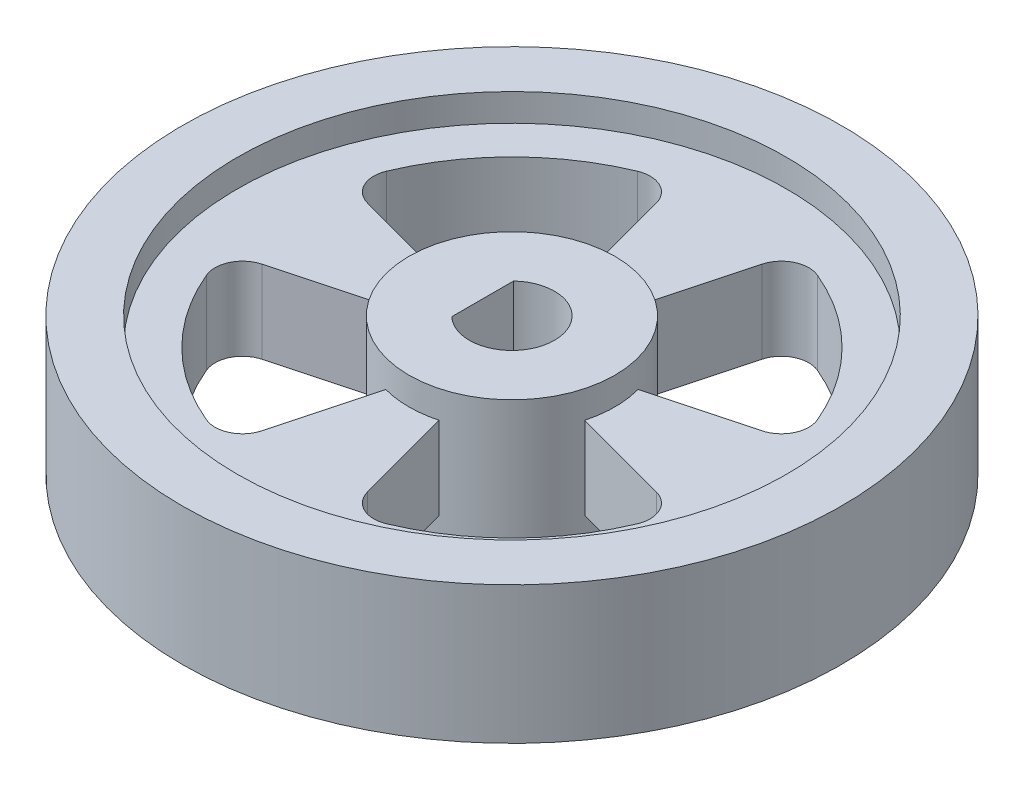
ISO-10303-21;
HEADER;
FILE_DESCRIPTION(('STEP AP214'),'2;1');
FILE_NAME('part.step','',(''),(''),'','','');
FILE_SCHEMA(('AUTOMOTIVE_DESIGN { 1 0 10303 214 1 1 1 1 }'));
ENDSEC;
DATA;
#1=APPLICATION_CONTEXT('core data for automotive mechanical design processes');
#2=APPLICATION_PROTOCOL_DEFINITION('international standard','automotive_design',2000,#1);
#3=PRODUCT_CONTEXT('',#1,'mechanical');
#4=PRODUCT('Part','Part','',(#3));
#5=PRODUCT_RELATED_PRODUCT_CATEGORY('part','',(#4));
#6=PRODUCT_DEFINITION_FORMATION('','',#4);
#7=PRODUCT_DEFINITION_CONTEXT('part definition',#1,'design');
#8=PRODUCT_DEFINITION('design','',#6,#7);
#9=PRODUCT_DEFINITION_SHAPE('','',#8);
#10=(LENGTH_UNIT() NAMED_UNIT(*) SI_UNIT(.MILLI.,.METRE.));
#11=(NAMED_UNIT(*) PLANE_ANGLE_UNIT() SI_UNIT($,.RADIAN.));
#12=(NAMED_UNIT(*) SI_UNIT($,.STERADIAN.) SOLID_ANGLE_UNIT());
#13=UNCERTAINTY_MEASURE_WITH_UNIT(LENGTH_MEASURE(1.E-05),#10,'distance_accuracy_value','');
#14=(GEOMETRIC_REPRESENTATION_CONTEXT(3) GLOBAL_UNCERTAINTY_ASSIGNED_CONTEXT((#13)) GLOBAL_UNIT_ASSIGNED_CONTEXT((#10,
#11,#12)) REPRESENTATION_CONTEXT('',''));
#15=CARTESIAN_POINT('',(0.,0.,0.));
#16=DIRECTION('',(0.,0.,1.));
#17=DIRECTION('',(1.,0.,0.));
#18=AXIS2_PLACEMENT_3D('',#15,#16,#17);
#19=CARTESIAN_POINT('',(0.,3.,0.));
#20=DIRECTION('',(0.,1.,0.));
#21=DIRECTION('',(0.,0.,1.));
#22=AXIS2_PLACEMENT_3D('',#19,#20,#21);
#23=PLANE('',#22);
#24=CARTESIAN_POINT('',(0.,3.,0.));
#25=DIRECTION('',(0.,1.,0.));
#26=DIRECTION('',(0.,0.,1.));
#27=AXIS2_PLACEMENT_3D('',#24,#25,#26);
#28=CIRCLE('',#27,20.);
#29=CARTESIAN_POINT('',(0.,3.,20.));
#30=VERTEX_POINT('',#29);
#31=EDGE_CURVE('E406',#30,#30,#28,.T.);
#32=ORIENTED_EDGE('',*,*,#31,.T.);
#33=EDGE_LOOP('',(#32));
#34=FACE_BOUND('',#33,.T.);
#35=CARTESIAN_POINT('',(0.,3.,0.));
#36=DIRECTION('',(0.,1.,0.));
#37=DIRECTION('',(0.,0.,1.));
#38=AXIS2_PLACEMENT_3D('',#35,#36,#37);
#39=CIRCLE('',#38,7.5);
#40=CARTESIAN_POINT('',(1.94114283826891,3.,7.24444369716801));
#41=VERTEX_POINT('',#40);
#42=CARTESIAN_POINT('',(-1.94114283826891,3.,7.24444369716801));
#43=VERTEX_POINT('',#42);
#44=EDGE_CURVE('E51',#41,#43,#39,.F.);
#45=ORIENTED_EDGE('',*,*,#44,.T.);
#46=DIRECTION('',(-0.258819045102522,0.,0.965925826289068));
#47=VECTOR('',#46,1.);
#48=CARTESIAN_POINT('',(0.,3.,0.));
#49=LINE('',#48,#47);
#50=CARTESIAN_POINT('',(-3.84762171760941,3.,14.3595197384237));
#51=VERTEX_POINT('',#50);
#52=EDGE_CURVE('E299',#43,#51,#49,.T.);
#53=ORIENTED_EDGE('',*,*,#52,.T.);
#54=CARTESIAN_POINT('',(-5.77947337018755,3.,13.8418816482187));
#55=DIRECTION('',(0.,1.,0.));
#56=DIRECTION('',(0.,0.,1.));
#57=AXIS2_PLACEMENT_3D('',#54,#55,#56);
#58=CIRCLE('',#57,2.);
#59=CARTESIAN_POINT('',(-6.55006981954588,3.,15.6874658679812));
#60=VERTEX_POINT('',#59);
#61=EDGE_CURVE('E296',#60,#51,#58,.T.);
#62=ORIENTED_EDGE('',*,*,#61,.F.);
#63=CARTESIAN_POINT('',(0.,3.,0.));
#64=DIRECTION('',(0.,1.,0.));
#65=DIRECTION('',(0.,0.,1.));
#66=AXIS2_PLACEMENT_3D('',#63,#64,#65);
#67=CIRCLE('',#66,17.);
#68=CARTESIAN_POINT('',(-15.6874658679812,3.,6.55006981954589));
#69=VERTEX_POINT('',#68);
#70=EDGE_CURVE('E293',#60,#69,#67,.F.);
#71=ORIENTED_EDGE('',*,*,#70,.T.);
#72=CARTESIAN_POINT('',(-13.8418816482187,3.,5.77947337018755));
#73=DIRECTION('',(0.,1.,0.));
#74=DIRECTION('',(0.,0.,1.));
#75=AXIS2_PLACEMENT_3D('',#72,#73,#74);
#76=CIRCLE('',#75,2.);
#77=CARTESIAN_POINT('',(-14.3595197384237,3.,3.84762171760942));
#78=VERTEX_POINT('',#77);
#79=EDGE_CURVE('E281',#78,#69,#76,.T.);
#80=ORIENTED_EDGE('',*,*,#79,.F.);
#81=DIRECTION('',(-0.965925826289068,0.,0.258819045102522));
#82=VECTOR('',#81,1.);
#83=CARTESIAN_POINT('',(0.,3.,0.));
#84=LINE('',#83,#82);
#85=CARTESIAN_POINT('',(-7.24444369716801,3.,1.94114283826891));
#86=VERTEX_POINT('',#85);
#87=EDGE_CURVE('E302',#86,#78,#84,.T.);
#88=ORIENTED_EDGE('',*,*,#87,.F.);
#89=CARTESIAN_POINT('',(-7.24444369716801,3.,-1.94114283826891));
#90=VERTEX_POINT('',#89);
#91=EDGE_CURVE('E12',#86,#90,#39,.F.);
#92=ORIENTED_EDGE('',*,*,#91,.T.);
#93=DIRECTION('',(-0.965925826289068,0.,-0.258819045102521));
#94=VECTOR('',#93,1.);
#95=CARTESIAN_POINT('',(0.,3.,0.));
#96=LINE('',#95,#94);
#97=CARTESIAN_POINT('',(-14.3595197384237,3.,-3.84762171760941));
#98=VERTEX_POINT('',#97);
#99=EDGE_CURVE('E375',#90,#98,#96,.T.);
#100=ORIENTED_EDGE('',*,*,#99,.T.);
#101=CARTESIAN_POINT('',(-13.8418816482187,3.,-5.77947337018755));
#102=DIRECTION('',(0.,1.,0.));
#103=DIRECTION('',(0.,0.,1.));
#104=AXIS2_PLACEMENT_3D('',#101,#102,#103);
#105=CIRCLE('',#104,2.);
#106=CARTESIAN_POINT('',(-15.6874658679812,3.,-6.55006981954588));
#107=VERTEX_POINT('',#106);
#108=EDGE_CURVE('E372',#107,#98,#105,.T.);
#109=ORIENTED_EDGE('',*,*,#108,.F.);
#110=CARTESIAN_POINT('',(0.,3.,0.));
#111=DIRECTION('',(0.,1.,0.));
#112=DIRECTION('',(0.,0.,1.));
#113=AXIS2_PLACEMENT_3D('',#110,#111,#112);
#114=CIRCLE('',#113,17.);
#115=CARTESIAN_POINT('',(-6.55006981954589,3.,-15.6874658679812));
#116=VERTEX_POINT('',#115);
#117=EDGE_CURVE('E308',#107,#116,#114,.F.);
#118=ORIENTED_EDGE('',*,*,#117,.T.);
#119=CARTESIAN_POINT('',(-5.77947337018755,3.,-13.8418816482187));
#120=DIRECTION('',(0.,1.,0.));
#121=DIRECTION('',(0.,0.,1.));
#122=AXIS2_PLACEMENT_3D('',#119,#120,#121);
#123=CIRCLE('',#122,2.);
#124=CARTESIAN_POINT('',(-3.84762171760942,3.,-14.3595197384237));
#125=VERTEX_POINT('',#124);
#126=EDGE_CURVE('E357',#125,#116,#123,.T.);
#127=ORIENTED_EDGE('',*,*,#126,.F.);
#128=DIRECTION('',(-0.258819045102522,0.,-0.965925826289068));
#129=VECTOR('',#128,1.);
#130=CARTESIAN_POINT('',(0.,3.,0.));
#131=LINE('',#130,#129);
#132=CARTESIAN_POINT('',(-1.94114283826891,3.,-7.24444369716801));
#133=VERTEX_POINT('',#132);
#134=EDGE_CURVE('E378',#133,#125,#131,.T.);
#135=ORIENTED_EDGE('',*,*,#134,.F.);
#136=CARTESIAN_POINT('',(1.94114283826891,3.,-7.24444369716801));
#137=VERTEX_POINT('',#136);
#138=EDGE_CURVE('E56',#133,#137,#39,.F.);
#139=ORIENTED_EDGE('',*,*,#138,.T.);
#140=DIRECTION('',(0.258819045102521,0.,-0.965925826289068));
#141=VECTOR('',#140,1.);
#142=CARTESIAN_POINT('',(0.,3.,0.));
#143=LINE('',#142,#141);
#144=CARTESIAN_POINT('',(3.84762171760941,3.,-14.3595197384237));
#145=VERTEX_POINT('',#144);
#146=EDGE_CURVE('E322',#137,#145,#143,.T.);
#147=ORIENTED_EDGE('',*,*,#146,.T.);
#148=CARTESIAN_POINT('',(5.77947337018755,3.,-13.8418816482187));
#149=DIRECTION('',(0.,1.,0.));
#150=DIRECTION('',(0.,0.,1.));
#151=AXIS2_PLACEMENT_3D('',#148,#149,#150);
#152=CIRCLE('',#151,2.);
#153=CARTESIAN_POINT('',(6.55006981954589,3.,-15.6874658679812));
#154=VERTEX_POINT('',#153);
#155=EDGE_CURVE('E340',#154,#145,#152,.T.);
#156=ORIENTED_EDGE('',*,*,#155,.F.);
#157=CARTESIAN_POINT('',(0.,3.,0.));
#158=DIRECTION('',(0.,1.,0.));
#159=DIRECTION('',(0.,0.,1.));
#160=AXIS2_PLACEMENT_3D('',#157,#158,#159);
#161=CIRCLE('',#160,17.);
#162=CARTESIAN_POINT('',(15.6874658679812,3.,-6.55006981954589));
#163=VERTEX_POINT('',#162);
#164=EDGE_CURVE('E337',#154,#163,#161,.F.);
#165=ORIENTED_EDGE('',*,*,#164,.T.);
#166=CARTESIAN_POINT('',(13.8418816482187,3.,-5.77947337018755));
#167=DIRECTION('',(0.,1.,0.));
#168=DIRECTION('',(0.,0.,1.));
#169=AXIS2_PLACEMENT_3D('',#166,#167,#168);
#170=CIRCLE('',#169,2.);
#171=CARTESIAN_POINT('',(14.3595197384237,3.,-3.84762171760942));
#172=VERTEX_POINT('',#171);
#173=EDGE_CURVE('E335',#172,#163,#170,.T.);
#174=ORIENTED_EDGE('',*,*,#173,.F.);
#175=DIRECTION('',(0.965925826289068,0.,-0.258819045102522));
#176=VECTOR('',#175,1.);
#177=CARTESIAN_POINT('',(0.,3.,0.));
#178=LINE('',#177,#176);
#179=CARTESIAN_POINT('',(7.24444369716801,3.,-1.94114283826891));
#180=VERTEX_POINT('',#179);
#181=EDGE_CURVE('E269',#180,#172,#178,.T.);
#182=ORIENTED_EDGE('',*,*,#181,.F.);
#183=CARTESIAN_POINT('',(7.24444369716801,3.,1.94114283826891));
#184=VERTEX_POINT('',#183);
#185=EDGE_CURVE('E802',#180,#184,#39,.F.);
#186=ORIENTED_EDGE('',*,*,#185,.T.);
#187=DIRECTION('',(0.965925826289068,0.,0.258819045102521));
#188=VECTOR('',#187,1.);
#189=CARTESIAN_POINT('',(0.,3.,0.));
#190=LINE('',#189,#188);
#191=CARTESIAN_POINT('',(14.3595197384237,3.,3.84762171760941));
#192=VERTEX_POINT('',#191);
#193=EDGE_CURVE('E263',#184,#192,#190,.T.);
#194=ORIENTED_EDGE('',*,*,#193,.T.);
#195=CARTESIAN_POINT('',(13.8418816482187,3.,5.77947337018755));
#196=DIRECTION('',(0.,1.,0.));
#197=DIRECTION('',(0.,0.,1.));
#198=AXIS2_PLACEMENT_3D('',#195,#196,#197);
#199=CIRCLE('',#198,2.);
#200=CARTESIAN_POINT('',(15.6874658679812,3.,6.55006981954589));
#201=VERTEX_POINT('',#200);
#202=EDGE_CURVE('E261',#201,#192,#199,.T.);
#203=ORIENTED_EDGE('',*,*,#202,.F.);
#204=CARTESIAN_POINT('',(0.,3.,0.));
#205=DIRECTION('',(0.,1.,0.));
#206=DIRECTION('',(0.,0.,1.));
#207=AXIS2_PLACEMENT_3D('',#204,#205,#206);
#208=CIRCLE('',#207,17.);
#209=CARTESIAN_POINT('',(6.55006981954589,3.,15.6874658679812));
#210=VERTEX_POINT('',#209);
#211=EDGE_CURVE('E229',#201,#210,#208,.F.);
#212=ORIENTED_EDGE('',*,*,#211,.T.);
#213=CARTESIAN_POINT('',(5.77947337018755,3.,13.8418816482187));
#214=DIRECTION('',(0.,1.,0.));
#215=DIRECTION('',(0.,0.,1.));
#216=AXIS2_PLACEMENT_3D('',#213,#214,#215);
#217=CIRCLE('',#216,2.);
#218=CARTESIAN_POINT('',(3.84762171760942,3.,14.3595197384237));
#219=VERTEX_POINT('',#218);
#220=EDGE_CURVE('E250',#219,#210,#217,.T.);
#221=ORIENTED_EDGE('',*,*,#220,.F.);
#222=DIRECTION('',(0.258819045102522,0.,0.965925826289068));
#223=VECTOR('',#222,1.);
#224=CARTESIAN_POINT('',(0.,3.,0.));
#225=LINE('',#224,#223);
#226=EDGE_CURVE('E253',#41,#219,#225,.T.);
#227=ORIENTED_EDGE('',*,*,#226,.F.);
#228=EDGE_LOOP('',(#45,#53,#62,#71,#80,#88,#92,#100,#109,#118,#127,#135,#139,#147,#156,#165,
#174,#182,#186,#194,#203,#212,#221,#227));
#229=FACE_BOUND('',#228,.T.);
#230=ADVANCED_FACE('F47',(#34,#229),#23,.T.);
#231=CARTESIAN_POINT('',(0.,-5.,0.));
#232=DIRECTION('',(0.,1.,0.));
#233=DIRECTION('',(0.,0.,1.));
#234=AXIS2_PLACEMENT_3D('',#231,#232,#233);
#235=CYLINDRICAL_SURFACE('',#234,3.1);
#236=DIRECTION('',(0.,1.,0.));
#237=VECTOR('',#236,1.);
#238=CARTESIAN_POINT('',(-2.13248681121361,-5.,2.25));
#239=LINE('',#238,#237);
#240=CARTESIAN_POINT('',(-2.13248681121361,-5.,2.25));
#241=VERTEX_POINT('',#240);
#242=CARTESIAN_POINT('',(-2.13248681121361,5.,2.25));
#243=VERTEX_POINT('',#242);
#244=EDGE_CURVE('E434',#241,#243,#239,.T.);
#245=ORIENTED_EDGE('',*,*,#244,.T.);
#246=CARTESIAN_POINT('',(0.,5.,0.));
#247=DIRECTION('',(0.,1.,0.));
#248=DIRECTION('',(0.,0.,1.));
#249=AXIS2_PLACEMENT_3D('',#246,#247,#248);
#250=CIRCLE('',#249,3.1);
#251=CARTESIAN_POINT('',(-2.13248681121361,5.,-2.25));
#252=VERTEX_POINT('',#251);
#253=EDGE_CURVE('E417',#243,#252,#250,.T.);
#254=ORIENTED_EDGE('',*,*,#253,.T.);
#255=DIRECTION('',(0.,1.,0.));
#256=VECTOR('',#255,1.);
#257=CARTESIAN_POINT('',(-2.13248681121361,-5.,-2.25));
#258=LINE('',#257,#256);
#259=CARTESIAN_POINT('',(-2.13248681121361,-5.,-2.25));
#260=VERTEX_POINT('',#259);
#261=EDGE_CURVE('E435',#260,#252,#258,.T.);
#262=ORIENTED_EDGE('',*,*,#261,.F.);
#263=CARTESIAN_POINT('',(0.,-5.,0.));
#264=DIRECTION('',(0.,1.,0.));
#265=DIRECTION('',(0.,0.,1.));
#266=AXIS2_PLACEMENT_3D('',#263,#264,#265);
#267=CIRCLE('',#266,3.1);
#268=EDGE_CURVE('E426',#241,#260,#267,.T.);
#269=ORIENTED_EDGE('',*,*,#268,.F.);
#270=EDGE_LOOP('',(#245,#254,#262,#269));
#271=FACE_BOUND('',#270,.T.);
#272=ADVANCED_FACE('F49',(#271),#235,.F.);
#273=CARTESIAN_POINT('',(-2.13248681121361,-5.,0.));
#274=DIRECTION('',(-1.,0.,0.));
#275=DIRECTION('',(0.,0.,1.));
#276=AXIS2_PLACEMENT_3D('',#273,#274,#275);
#277=PLANE('',#276);
#278=ORIENTED_EDGE('',*,*,#261,.T.);
#279=DIRECTION('',(0.,0.,1.));
#280=VECTOR('',#279,1.);
#281=CARTESIAN_POINT('',(-2.13248681121361,5.,0.));
#282=LINE('',#281,#280);
#283=EDGE_CURVE('E420',#252,#243,#282,.T.);
#284=ORIENTED_EDGE('',*,*,#283,.T.);
#285=ORIENTED_EDGE('',*,*,#244,.F.);
#286=DIRECTION('',(0.,0.,1.));
#287=VECTOR('',#286,1.);
#288=CARTESIAN_POINT('',(-2.13248681121361,-5.,0.));
#289=LINE('',#288,#287);
#290=EDGE_CURVE('E429',#260,#241,#289,.T.);
#291=ORIENTED_EDGE('',*,*,#290,.F.);
#292=EDGE_LOOP('',(#278,#284,#285,#291));
#293=FACE_BOUND('',#292,.T.);
#294=ADVANCED_FACE('F446',(#293),#277,.F.);
#295=CARTESIAN_POINT('',(0.,-5.,0.));
#296=DIRECTION('',(0.,1.,0.));
#297=DIRECTION('',(0.,0.,1.));
#298=AXIS2_PLACEMENT_3D('',#295,#296,#297);
#299=CYLINDRICAL_SURFACE('',#298,7.5);
#300=DIRECTION('',(0.,1.,0.));
#301=VECTOR('',#300,1.);
#302=CARTESIAN_POINT('',(-7.24444369716801,-3.,1.94114283826891));
#303=LINE('',#302,#301);
#304=CARTESIAN_POINT('',(-7.24444369716801,-3.,1.94114283826891));
#305=VERTEX_POINT('',#304);
#306=EDGE_CURVE('E312',#305,#86,#303,.T.);
#307=ORIENTED_EDGE('',*,*,#306,.F.);
#308=CARTESIAN_POINT('',(0.,-3.,0.));
#309=DIRECTION('',(0.,1.,0.));
#310=DIRECTION('',(0.,0.,1.));
#311=AXIS2_PLACEMENT_3D('',#308,#309,#310);
#312=CIRCLE('',#311,7.5);
#313=CARTESIAN_POINT('',(-7.24444369716801,-3.,-1.94114283826891));
#314=VERTEX_POINT('',#313);
#315=EDGE_CURVE('E412',#314,#305,#312,.T.);
#316=ORIENTED_EDGE('',*,*,#315,.F.);
#317=DIRECTION('',(0.,1.,0.));
#318=VECTOR('',#317,1.);
#319=CARTESIAN_POINT('',(-7.24444369716801,-3.,-1.94114283826891));
#320=LINE('',#319,#318);
#321=EDGE_CURVE('E390',#314,#90,#320,.T.);
#322=ORIENTED_EDGE('',*,*,#321,.T.);
#323=ORIENTED_EDGE('',*,*,#91,.F.);
#324=EDGE_LOOP('',(#307,#316,#322,#323));
#325=FACE_BOUND('',#324,.T.);
#326=DIRECTION('',(0.,1.,0.));
#327=VECTOR('',#326,1.);
#328=CARTESIAN_POINT('',(7.24444369716801,-3.,-1.94114283826891));
#329=LINE('',#328,#327);
#330=CARTESIAN_POINT('',(7.24444369716801,-3.,-1.94114283826891));
#331=VERTEX_POINT('',#330);
#332=EDGE_CURVE('E297',#331,#180,#329,.T.);
#333=ORIENTED_EDGE('',*,*,#332,.F.);
#334=CARTESIAN_POINT('',(7.24444369716801,-3.,1.94114283826891));
#335=VERTEX_POINT('',#334);
#336=EDGE_CURVE('E413',#335,#331,#312,.T.);
#337=ORIENTED_EDGE('',*,*,#336,.F.);
#338=DIRECTION('',(0.,1.,0.));
#339=VECTOR('',#338,1.);
#340=CARTESIAN_POINT('',(7.24444369716801,-3.,1.94114283826891));
#341=LINE('',#340,#339);
#342=EDGE_CURVE('E275',#335,#184,#341,.T.);
#343=ORIENTED_EDGE('',*,*,#342,.T.);
#344=ORIENTED_EDGE('',*,*,#185,.F.);
#345=EDGE_LOOP('',(#333,#337,#343,#344));
#346=FACE_BOUND('',#345,.T.);
#347=CARTESIAN_POINT('',(1.94114283826891,-3.,-7.24444369716801));
#348=VERTEX_POINT('',#347);
#349=CARTESIAN_POINT('',(-1.94114283826891,-3.,-7.24444369716801));
#350=VERTEX_POINT('',#349);
#351=EDGE_CURVE('E815',#348,#350,#312,.T.);
#352=ORIENTED_EDGE('',*,*,#351,.F.);
#353=DIRECTION('',(0.,1.,0.));
#354=VECTOR('',#353,1.);
#355=CARTESIAN_POINT('',(1.94114283826891,-3.,-7.24444369716801));
#356=LINE('',#355,#354);
#357=EDGE_CURVE('E345',#348,#137,#356,.T.);
#358=ORIENTED_EDGE('',*,*,#357,.T.);
#359=ORIENTED_EDGE('',*,*,#138,.F.);
#360=DIRECTION('',(0.,1.,0.));
#361=VECTOR('',#360,1.);
#362=CARTESIAN_POINT('',(-1.94114283826891,-3.,-7.24444369716801));
#363=LINE('',#362,#361);
#364=EDGE_CURVE('E388',#350,#133,#363,.T.);
#365=ORIENTED_EDGE('',*,*,#364,.F.);
#366=EDGE_LOOP('',(#352,#358,#359,#365));
#367=FACE_BOUND('',#366,.T.);
#368=CARTESIAN_POINT('',(-1.94114283826891,-3.,7.24444369716801));
#369=VERTEX_POINT('',#368);
#370=CARTESIAN_POINT('',(1.94114283826891,-3.,7.24444369716801));
#371=VERTEX_POINT('',#370);
#372=EDGE_CURVE('E409',#369,#371,#312,.T.);
#373=ORIENTED_EDGE('',*,*,#372,.F.);
#374=DIRECTION('',(0.,1.,0.));
#375=VECTOR('',#374,1.);
#376=CARTESIAN_POINT('',(-1.94114283826891,-3.,7.24444369716801));
#377=LINE('',#376,#375);
#378=EDGE_CURVE('E314',#369,#43,#377,.T.);
#379=ORIENTED_EDGE('',*,*,#378,.T.);
#380=ORIENTED_EDGE('',*,*,#44,.F.);
#381=DIRECTION('',(0.,1.,0.));
#382=VECTOR('',#381,1.);
#383=CARTESIAN_POINT('',(1.94114283826891,-3.,7.24444369716801));
#384=LINE('',#383,#382);
#385=EDGE_CURVE('E273',#371,#41,#384,.T.);
#386=ORIENTED_EDGE('',*,*,#385,.F.);
#387=EDGE_LOOP('',(#373,#379,#380,#386));
#388=FACE_BOUND('',#387,.T.);
#389=CARTESIAN_POINT('',(0.,5.,0.));
#390=DIRECTION('',(0.,1.,0.));
#391=DIRECTION('',(0.,0.,1.));
#392=AXIS2_PLACEMENT_3D('',#389,#390,#391);
#393=CIRCLE('',#392,7.5);
#394=CARTESIAN_POINT('',(0.,5.,7.5));
#395=VERTEX_POINT('',#394);
#396=EDGE_CURVE('E423',#395,#395,#393,.T.);
#397=ORIENTED_EDGE('',*,*,#396,.F.);
#398=EDGE_LOOP('',(#397));
#399=FACE_BOUND('',#398,.T.);
#400=CARTESIAN_POINT('',(0.,-5.,0.));
#401=DIRECTION('',(0.,1.,0.));
#402=DIRECTION('',(0.,0.,1.));
#403=AXIS2_PLACEMENT_3D('',#400,#401,#402);
#404=CIRCLE('',#403,7.5);
#405=CARTESIAN_POINT('',(0.,-5.,7.5));
#406=VERTEX_POINT('',#405);
#407=EDGE_CURVE('E431',#406,#406,#404,.T.);
#408=ORIENTED_EDGE('',*,*,#407,.T.);
#409=EDGE_LOOP('',(#408));
#410=FACE_BOUND('',#409,.T.);
#411=ADVANCED_FACE('F451',(#325,#346,#367,#388,#399,#410),#299,.T.);
#412=CARTESIAN_POINT('',(0.,-5.,0.));
#413=DIRECTION('',(0.,1.,0.));
#414=DIRECTION('',(0.,0.,1.));
#415=AXIS2_PLACEMENT_3D('',#412,#413,#414);
#416=PLANE('',#415);
#417=ORIENTED_EDGE('',*,*,#268,.T.);
#418=ORIENTED_EDGE('',*,*,#290,.T.);
#419=EDGE_LOOP('',(#417,#418));
#420=FACE_BOUND('',#419,.T.);
#421=ORIENTED_EDGE('',*,*,#407,.F.);
#422=EDGE_LOOP('',(#421));
#423=FACE_BOUND('',#422,.T.);
#424=ADVANCED_FACE('F448',(#420,#423),#416,.F.);
#425=CARTESIAN_POINT('',(0.,5.,0.));
#426=DIRECTION('',(0.,1.,0.));
#427=DIRECTION('',(0.,0.,1.));
#428=AXIS2_PLACEMENT_3D('',#425,#426,#427);
#429=PLANE('',#428);
#430=ORIENTED_EDGE('',*,*,#253,.F.);
#431=ORIENTED_EDGE('',*,*,#283,.F.);
#432=EDGE_LOOP('',(#430,#431));
#433=FACE_BOUND('',#432,.T.);
#434=ORIENTED_EDGE('',*,*,#396,.T.);
#435=EDGE_LOOP('',(#434));
#436=FACE_BOUND('',#435,.T.);
#437=ADVANCED_FACE('F444',(#433,#436),#429,.T.);
#438=CARTESIAN_POINT('',(0.,-3.,0.));
#439=DIRECTION('',(0.,1.,0.));
#440=DIRECTION('',(0.,0.,1.));
#441=AXIS2_PLACEMENT_3D('',#438,#439,#440);
#442=PLANE('',#441);
#443=ORIENTED_EDGE('',*,*,#315,.T.);
#444=DIRECTION('',(-0.965925826289068,0.,0.258819045102522));
#445=VECTOR('',#444,1.);
#446=CARTESIAN_POINT('',(0.,-3.,0.));
#447=LINE('',#446,#445);
#448=CARTESIAN_POINT('',(-14.3595197384237,-3.,3.84762171760942));
#449=VERTEX_POINT('',#448);
#450=EDGE_CURVE('E286',#305,#449,#447,.T.);
#451=ORIENTED_EDGE('',*,*,#450,.T.);
#452=CARTESIAN_POINT('',(-13.8418816482187,-3.,5.77947337018755));
#453=DIRECTION('',(0.,1.,0.));
#454=DIRECTION('',(0.,0.,1.));
#455=AXIS2_PLACEMENT_3D('',#452,#453,#454);
#456=CIRCLE('',#455,2.);
#457=CARTESIAN_POINT('',(-15.6874658679812,-3.,6.55006981954589));
#458=VERTEX_POINT('',#457);
#459=EDGE_CURVE('E289',#449,#458,#456,.T.);
#460=ORIENTED_EDGE('',*,*,#459,.T.);
#461=CARTESIAN_POINT('',(0.,-3.,0.));
#462=DIRECTION('',(0.,1.,0.));
#463=DIRECTION('',(0.,0.,1.));
#464=AXIS2_PLACEMENT_3D('',#461,#462,#463);
#465=CIRCLE('',#464,17.);
#466=CARTESIAN_POINT('',(-6.55006981954588,-3.,15.6874658679812));
#467=VERTEX_POINT('',#466);
#468=EDGE_CURVE('E278',#467,#458,#465,.F.);
#469=ORIENTED_EDGE('',*,*,#468,.F.);
#470=CARTESIAN_POINT('',(-5.77947337018755,-3.,13.8418816482187));
#471=DIRECTION('',(0.,1.,0.));
#472=DIRECTION('',(0.,0.,1.));
#473=AXIS2_PLACEMENT_3D('',#470,#471,#472);
#474=CIRCLE('',#473,2.);
#475=CARTESIAN_POINT('',(-3.84762171760941,-3.,14.3595197384237));
#476=VERTEX_POINT('',#475);
#477=EDGE_CURVE('E280',#467,#476,#474,.T.);
#478=ORIENTED_EDGE('',*,*,#477,.T.);
#479=DIRECTION('',(-0.258819045102522,0.,0.965925826289068));
#480=VECTOR('',#479,1.);
#481=CARTESIAN_POINT('',(0.,-3.,0.));
#482=LINE('',#481,#480);
#483=EDGE_CURVE('E284',#369,#476,#482,.T.);
#484=ORIENTED_EDGE('',*,*,#483,.F.);
#485=ORIENTED_EDGE('',*,*,#372,.T.);
#486=DIRECTION('',(0.258819045102522,0.,0.965925826289068));
#487=VECTOR('',#486,1.);
#488=CARTESIAN_POINT('',(0.,-3.,0.));
#489=LINE('',#488,#487);
#490=CARTESIAN_POINT('',(3.84762171760942,-3.,14.3595197384237));
#491=VERTEX_POINT('',#490);
#492=EDGE_CURVE('E257',#371,#491,#489,.T.);
#493=ORIENTED_EDGE('',*,*,#492,.T.);
#494=CARTESIAN_POINT('',(5.77947337018755,-3.,13.8418816482187));
#495=DIRECTION('',(0.,1.,0.));
#496=DIRECTION('',(0.,0.,1.));
#497=AXIS2_PLACEMENT_3D('',#494,#495,#496);
#498=CIRCLE('',#497,2.);
#499=CARTESIAN_POINT('',(6.55006981954589,-3.,15.6874658679812));
#500=VERTEX_POINT('',#499);
#501=EDGE_CURVE('E234',#491,#500,#498,.T.);
#502=ORIENTED_EDGE('',*,*,#501,.T.);
#503=CARTESIAN_POINT('',(0.,-3.,0.));
#504=DIRECTION('',(0.,1.,0.));
#505=DIRECTION('',(0.,0.,1.));
#506=AXIS2_PLACEMENT_3D('',#503,#504,#505);
#507=CIRCLE('',#506,17.);
#508=CARTESIAN_POINT('',(15.6874658679812,-3.,6.55006981954589));
#509=VERTEX_POINT('',#508);
#510=EDGE_CURVE('E226',#509,#500,#507,.F.);
#511=ORIENTED_EDGE('',*,*,#510,.F.);
#512=CARTESIAN_POINT('',(13.8418816482187,-3.,5.77947337018755));
#513=DIRECTION('',(0.,1.,0.));
#514=DIRECTION('',(0.,0.,1.));
#515=AXIS2_PLACEMENT_3D('',#512,#513,#514);
#516=CIRCLE('',#515,2.);
#517=CARTESIAN_POINT('',(14.3595197384237,-3.,3.84762171760941));
#518=VERTEX_POINT('',#517);
#519=EDGE_CURVE('E237',#509,#518,#516,.T.);
#520=ORIENTED_EDGE('',*,*,#519,.T.);
#521=DIRECTION('',(0.965925826289068,0.,0.258819045102521));
#522=VECTOR('',#521,1.);
#523=CARTESIAN_POINT('',(0.,-3.,0.));
#524=LINE('',#523,#522);
#525=EDGE_CURVE('E242',#335,#518,#524,.T.);
#526=ORIENTED_EDGE('',*,*,#525,.F.);
#527=ORIENTED_EDGE('',*,*,#336,.T.);
#528=DIRECTION('',(0.965925826289068,0.,-0.258819045102522));
#529=VECTOR('',#528,1.);
#530=CARTESIAN_POINT('',(0.,-3.,0.));
#531=LINE('',#530,#529);
#532=CARTESIAN_POINT('',(14.3595197384237,-3.,-3.84762171760942));
#533=VERTEX_POINT('',#532);
#534=EDGE_CURVE('E318',#331,#533,#531,.T.);
#535=ORIENTED_EDGE('',*,*,#534,.T.);
#536=CARTESIAN_POINT('',(13.8418816482187,-3.,-5.77947337018755));
#537=DIRECTION('',(0.,1.,0.));
#538=DIRECTION('',(0.,0.,1.));
#539=AXIS2_PLACEMENT_3D('',#536,#537,#538);
#540=CIRCLE('',#539,2.);
#541=CARTESIAN_POINT('',(15.6874658679812,-3.,-6.55006981954589));
#542=VERTEX_POINT('',#541);
#543=EDGE_CURVE('E321',#533,#542,#540,.T.);
#544=ORIENTED_EDGE('',*,*,#543,.T.);
#545=CARTESIAN_POINT('',(0.,-3.,0.));
#546=DIRECTION('',(0.,1.,0.));
#547=DIRECTION('',(0.,0.,1.));
#548=AXIS2_PLACEMENT_3D('',#545,#546,#547);
#549=CIRCLE('',#548,17.);
#550=CARTESIAN_POINT('',(6.55006981954589,-3.,-15.6874658679812));
#551=VERTEX_POINT('',#550);
#552=EDGE_CURVE('E325',#551,#542,#549,.F.);
#553=ORIENTED_EDGE('',*,*,#552,.F.);
#554=CARTESIAN_POINT('',(5.77947337018755,-3.,-13.8418816482187));
#555=DIRECTION('',(0.,1.,0.));
#556=DIRECTION('',(0.,0.,1.));
#557=AXIS2_PLACEMENT_3D('',#554,#555,#556);
#558=CIRCLE('',#557,2.);
#559=CARTESIAN_POINT('',(3.84762171760941,-3.,-14.3595197384237));
#560=VERTEX_POINT('',#559);
#561=EDGE_CURVE('E327',#551,#560,#558,.T.);
#562=ORIENTED_EDGE('',*,*,#561,.T.);
#563=DIRECTION('',(0.258819045102521,0.,-0.965925826289068));
#564=VECTOR('',#563,1.);
#565=CARTESIAN_POINT('',(0.,-3.,0.));
#566=LINE('',#565,#564);
#567=EDGE_CURVE('E330',#348,#560,#566,.T.);
#568=ORIENTED_EDGE('',*,*,#567,.F.);
#569=ORIENTED_EDGE('',*,*,#351,.T.);
#570=DIRECTION('',(-0.258819045102522,0.,-0.965925826289068));
#571=VECTOR('',#570,1.);
#572=CARTESIAN_POINT('',(0.,-3.,0.));
#573=LINE('',#572,#571);
#574=CARTESIAN_POINT('',(-3.84762171760942,-3.,-14.3595197384237));
#575=VERTEX_POINT('',#574);
#576=EDGE_CURVE('E363',#350,#575,#573,.T.);
#577=ORIENTED_EDGE('',*,*,#576,.T.);
#578=CARTESIAN_POINT('',(-5.77947337018755,-3.,-13.8418816482187));
#579=DIRECTION('',(0.,1.,0.));
#580=DIRECTION('',(0.,0.,1.));
#581=AXIS2_PLACEMENT_3D('',#578,#579,#580);
#582=CIRCLE('',#581,2.);
#583=CARTESIAN_POINT('',(-6.55006981954589,-3.,-15.6874658679812));
#584=VERTEX_POINT('',#583);
#585=EDGE_CURVE('E366',#575,#584,#582,.T.);
#586=ORIENTED_EDGE('',*,*,#585,.T.);
#587=CARTESIAN_POINT('',(0.,-3.,0.));
#588=DIRECTION('',(0.,1.,0.));
#589=DIRECTION('',(0.,0.,1.));
#590=AXIS2_PLACEMENT_3D('',#587,#588,#589);
#591=CIRCLE('',#590,17.);
#592=CARTESIAN_POINT('',(-15.6874658679812,-3.,-6.55006981954588));
#593=VERTEX_POINT('',#592);
#594=EDGE_CURVE('E354',#593,#584,#591,.F.);
#595=ORIENTED_EDGE('',*,*,#594,.F.);
#596=CARTESIAN_POINT('',(-13.8418816482187,-3.,-5.77947337018755));
#597=DIRECTION('',(0.,1.,0.));
#598=DIRECTION('',(0.,0.,1.));
#599=AXIS2_PLACEMENT_3D('',#596,#597,#598);
#600=CIRCLE('',#599,2.);
#601=CARTESIAN_POINT('',(-14.3595197384237,-3.,-3.84762171760941));
#602=VERTEX_POINT('',#601);
#603=EDGE_CURVE('E356',#593,#602,#600,.T.);
#604=ORIENTED_EDGE('',*,*,#603,.T.);
#605=DIRECTION('',(-0.965925826289068,0.,-0.258819045102521));
#606=VECTOR('',#605,1.);
#607=CARTESIAN_POINT('',(0.,-3.,0.));
#608=LINE('',#607,#606);
#609=EDGE_CURVE('E360',#314,#602,#608,.T.);
#610=ORIENTED_EDGE('',*,*,#609,.F.);
#611=EDGE_LOOP('',(#443,#451,#460,#469,#478,#484,#485,#493,#502,#511,#520,#526,#527,#535,#544,
#553,#562,#568,#569,#577,#586,#595,#604,#610));
#612=FACE_BOUND('',#611,.T.);
#613=CARTESIAN_POINT('',(0.,-3.,0.));
#614=DIRECTION('',(0.,1.,0.));
#615=DIRECTION('',(0.,0.,1.));
#616=AXIS2_PLACEMENT_3D('',#613,#614,#615);
#617=CIRCLE('',#616,20.);
#618=CARTESIAN_POINT('',(0.,-3.,20.));
#619=VERTEX_POINT('',#618);
#620=EDGE_CURVE('E414',#619,#619,#617,.T.);
#621=ORIENTED_EDGE('',*,*,#620,.F.);
#622=EDGE_LOOP('',(#621));
#623=FACE_BOUND('',#622,.T.);
#624=ADVANCED_FACE('F246',(#612,#623),#442,.F.);
#625=CARTESIAN_POINT('',(0.,-5.,0.));
#626=DIRECTION('',(0.,1.,0.));
#627=DIRECTION('',(0.,0.,1.));
#628=AXIS2_PLACEMENT_3D('',#625,#626,#627);
#629=CYLINDRICAL_SURFACE('',#628,20.);
#630=CARTESIAN_POINT('',(0.,-5.,0.));
#631=DIRECTION('',(0.,1.,0.));
#632=DIRECTION('',(0.,0.,1.));
#633=AXIS2_PLACEMENT_3D('',#630,#631,#632);
#634=CIRCLE('',#633,20.);
#635=CARTESIAN_POINT('',(0.,-5.,20.));
#636=VERTEX_POINT('',#635);
#637=EDGE_CURVE('E400',#636,#636,#634,.T.);
#638=ORIENTED_EDGE('',*,*,#637,.F.);
#639=EDGE_LOOP('',(#638));
#640=FACE_BOUND('',#639,.T.);
#641=ORIENTED_EDGE('',*,*,#620,.T.);
#642=EDGE_LOOP('',(#641));
#643=FACE_BOUND('',#642,.T.);
#644=ADVANCED_FACE('F475',(#640,#643),#629,.F.);
#645=ORIENTED_EDGE('',*,*,#31,.F.);
#646=EDGE_LOOP('',(#645));
#647=FACE_BOUND('',#646,.T.);
#648=CARTESIAN_POINT('',(0.,5.,0.));
#649=DIRECTION('',(0.,1.,0.));
#650=DIRECTION('',(0.,0.,1.));
#651=AXIS2_PLACEMENT_3D('',#648,#649,#650);
#652=CIRCLE('',#651,20.);
#653=CARTESIAN_POINT('',(0.,5.,20.));
#654=VERTEX_POINT('',#653);
#655=EDGE_CURVE('E384',#654,#654,#652,.T.);
#656=ORIENTED_EDGE('',*,*,#655,.T.);
#657=EDGE_LOOP('',(#656));
#658=FACE_BOUND('',#657,.T.);
#659=ADVANCED_FACE('F471',(#647,#658),#629,.F.);
#660=CARTESIAN_POINT('',(0.,-5.,0.));
#661=DIRECTION('',(0.,1.,0.));
#662=DIRECTION('',(0.,0.,1.));
#663=AXIS2_PLACEMENT_3D('',#660,#661,#662);
#664=CYLINDRICAL_SURFACE('',#663,24.);
#665=CARTESIAN_POINT('',(0.,-5.,0.));
#666=DIRECTION('',(0.,1.,0.));
#667=DIRECTION('',(0.,0.,1.));
#668=AXIS2_PLACEMENT_3D('',#665,#666,#667);
#669=CIRCLE('',#668,24.);
#670=CARTESIAN_POINT('',(0.,-5.,24.));
#671=VERTEX_POINT('',#670);
#672=EDGE_CURVE('E403',#671,#671,#669,.T.);
#673=ORIENTED_EDGE('',*,*,#672,.T.);
#674=EDGE_LOOP('',(#673));
#675=FACE_BOUND('',#674,.T.);
#676=CARTESIAN_POINT('',(0.,5.,0.));
#677=DIRECTION('',(0.,1.,0.));
#678=DIRECTION('',(0.,0.,1.));
#679=AXIS2_PLACEMENT_3D('',#676,#677,#678);
#680=CIRCLE('',#679,24.);
#681=CARTESIAN_POINT('',(0.,5.,24.));
#682=VERTEX_POINT('',#681);
#683=EDGE_CURVE('E397',#682,#682,#680,.T.);
#684=ORIENTED_EDGE('',*,*,#683,.F.);
#685=EDGE_LOOP('',(#684));
#686=FACE_BOUND('',#685,.T.);
#687=ADVANCED_FACE('F498',(#675,#686),#664,.T.);
#688=CARTESIAN_POINT('',(0.,-5.,0.));
#689=DIRECTION('',(0.,1.,0.));
#690=DIRECTION('',(0.,0.,1.));
#691=AXIS2_PLACEMENT_3D('',#688,#689,#690);
#692=PLANE('',#691);
#693=ORIENTED_EDGE('',*,*,#637,.T.);
#694=EDGE_LOOP('',(#693));
#695=FACE_BOUND('',#694,.T.);
#696=ORIENTED_EDGE('',*,*,#672,.F.);
#697=EDGE_LOOP('',(#696));
#698=FACE_BOUND('',#697,.T.);
#699=ADVANCED_FACE('F505',(#695,#698),#692,.F.);
#700=CARTESIAN_POINT('',(0.,5.,0.));
#701=DIRECTION('',(0.,1.,0.));
#702=DIRECTION('',(0.,0.,1.));
#703=AXIS2_PLACEMENT_3D('',#700,#701,#702);
#704=PLANE('',#703);
#705=ORIENTED_EDGE('',*,*,#655,.F.);
#706=EDGE_LOOP('',(#705));
#707=FACE_BOUND('',#706,.T.);
#708=ORIENTED_EDGE('',*,*,#683,.T.);
#709=EDGE_LOOP('',(#708));
#710=FACE_BOUND('',#709,.T.);
#711=ADVANCED_FACE('F512',(#707,#710),#704,.T.);
#712=CARTESIAN_POINT('',(0.,-3.,0.));
#713=DIRECTION('',(0.,1.,0.));
#714=DIRECTION('',(0.,0.,1.));
#715=AXIS2_PLACEMENT_3D('',#712,#713,#714);
#716=CYLINDRICAL_SURFACE('',#715,17.);
#717=ORIENTED_EDGE('',*,*,#117,.F.);
#718=DIRECTION('',(0.,1.,0.));
#719=VECTOR('',#718,1.);
#720=CARTESIAN_POINT('',(-15.6874658679812,-3.,-6.55006981954588));
#721=LINE('',#720,#719);
#722=EDGE_CURVE('E369',#593,#107,#721,.T.);
#723=ORIENTED_EDGE('',*,*,#722,.F.);
#724=ORIENTED_EDGE('',*,*,#594,.T.);
#725=DIRECTION('',(0.,1.,0.));
#726=VECTOR('',#725,1.);
#727=CARTESIAN_POINT('',(-6.55006981954589,-3.,-15.6874658679812));
#728=LINE('',#727,#726);
#729=EDGE_CURVE('E382',#584,#116,#728,.T.);
#730=ORIENTED_EDGE('',*,*,#729,.T.);
#731=EDGE_LOOP('',(#717,#723,#724,#730));
#732=FACE_BOUND('',#731,.T.);
#733=ADVANCED_FACE('F520',(#732),#716,.F.);
#734=CARTESIAN_POINT('',(-5.77947337018755,-3.,-13.8418816482187));
#735=DIRECTION('',(0.,1.,0.));
#736=DIRECTION('',(0.,0.,1.));
#737=AXIS2_PLACEMENT_3D('',#734,#735,#736);
#738=CYLINDRICAL_SURFACE('',#737,2.);
#739=ORIENTED_EDGE('',*,*,#126,.T.);
#740=ORIENTED_EDGE('',*,*,#729,.F.);
#741=ORIENTED_EDGE('',*,*,#585,.F.);
#742=DIRECTION('',(0.,1.,0.));
#743=VECTOR('',#742,1.);
#744=CARTESIAN_POINT('',(-3.84762171760942,-3.,-14.3595197384237));
#745=LINE('',#744,#743);
#746=EDGE_CURVE('E385',#575,#125,#745,.T.);
#747=ORIENTED_EDGE('',*,*,#746,.T.);
#748=EDGE_LOOP('',(#739,#740,#741,#747));
#749=FACE_BOUND('',#748,.T.);
#750=ADVANCED_FACE('F527',(#749),#738,.F.);
#751=CARTESIAN_POINT('',(0.,-3.,0.));
#752=DIRECTION('',(0.965925826289068,0.,-0.258819045102522));
#753=DIRECTION('',(-0.258819045102522,0.,-0.965925826289068));
#754=AXIS2_PLACEMENT_3D('',#751,#752,#753);
#755=PLANE('',#754);
#756=ORIENTED_EDGE('',*,*,#134,.T.);
#757=ORIENTED_EDGE('',*,*,#746,.F.);
#758=ORIENTED_EDGE('',*,*,#576,.F.);
#759=ORIENTED_EDGE('',*,*,#364,.T.);
#760=EDGE_LOOP('',(#756,#757,#758,#759));
#761=FACE_BOUND('',#760,.T.);
#762=ADVANCED_FACE('F535',(#761),#755,.F.);
#763=CARTESIAN_POINT('',(0.,-3.,0.));
#764=DIRECTION('',(0.258819045102521,0.,-0.965925826289068));
#765=DIRECTION('',(-0.965925826289068,0.,-0.258819045102521));
#766=AXIS2_PLACEMENT_3D('',#763,#764,#765);
#767=PLANE('',#766);
#768=ORIENTED_EDGE('',*,*,#99,.F.);
#769=ORIENTED_EDGE('',*,*,#321,.F.);
#770=ORIENTED_EDGE('',*,*,#609,.T.);
#771=DIRECTION('',(0.,1.,0.));
#772=VECTOR('',#771,1.);
#773=CARTESIAN_POINT('',(-14.3595197384237,-3.,-3.84762171760941));
#774=LINE('',#773,#772);
#775=EDGE_CURVE('E392',#602,#98,#774,.T.);
#776=ORIENTED_EDGE('',*,*,#775,.T.);
#777=EDGE_LOOP('',(#768,#769,#770,#776));
#778=FACE_BOUND('',#777,.T.);
#779=ADVANCED_FACE('F543',(#778),#767,.T.);
#780=CARTESIAN_POINT('',(-13.8418816482187,-3.,-5.77947337018755));
#781=DIRECTION('',(0.,1.,0.));
#782=DIRECTION('',(0.,0.,1.));
#783=AXIS2_PLACEMENT_3D('',#780,#781,#782);
#784=CYLINDRICAL_SURFACE('',#783,2.);
#785=ORIENTED_EDGE('',*,*,#108,.T.);
#786=ORIENTED_EDGE('',*,*,#775,.F.);
#787=ORIENTED_EDGE('',*,*,#603,.F.);
#788=ORIENTED_EDGE('',*,*,#722,.T.);
#789=EDGE_LOOP('',(#785,#786,#787,#788));
#790=FACE_BOUND('',#789,.T.);
#791=ADVANCED_FACE('F551',(#790),#784,.F.);
#792=CARTESIAN_POINT('',(0.,-3.,0.));
#793=DIRECTION('',(0.,1.,0.));
#794=DIRECTION('',(0.,0.,1.));
#795=AXIS2_PLACEMENT_3D('',#792,#793,#794);
#796=CYLINDRICAL_SURFACE('',#795,17.);
#797=ORIENTED_EDGE('',*,*,#211,.F.);
#798=DIRECTION('',(0.,1.,0.));
#799=VECTOR('',#798,1.);
#800=CARTESIAN_POINT('',(15.6874658679812,-3.,6.55006981954589));
#801=LINE('',#800,#799);
#802=EDGE_CURVE('E222',#509,#201,#801,.T.);
#803=ORIENTED_EDGE('',*,*,#802,.F.);
#804=ORIENTED_EDGE('',*,*,#510,.T.);
#805=DIRECTION('',(0.,1.,0.));
#806=VECTOR('',#805,1.);
#807=CARTESIAN_POINT('',(6.55006981954589,-3.,15.6874658679812));
#808=LINE('',#807,#806);
#809=EDGE_CURVE('E267',#500,#210,#808,.T.);
#810=ORIENTED_EDGE('',*,*,#809,.T.);
#811=EDGE_LOOP('',(#797,#803,#804,#810));
#812=FACE_BOUND('',#811,.T.);
#813=ADVANCED_FACE('F224',(#812),#796,.F.);
#814=CARTESIAN_POINT('',(5.77947337018755,-3.,13.8418816482187));
#815=DIRECTION('',(0.,1.,0.));
#816=DIRECTION('',(0.,0.,1.));
#817=AXIS2_PLACEMENT_3D('',#814,#815,#816);
#818=CYLINDRICAL_SURFACE('',#817,2.);
#819=ORIENTED_EDGE('',*,*,#220,.T.);
#820=ORIENTED_EDGE('',*,*,#809,.F.);
#821=ORIENTED_EDGE('',*,*,#501,.F.);
#822=DIRECTION('',(0.,1.,0.));
#823=VECTOR('',#822,1.);
#824=CARTESIAN_POINT('',(3.84762171760942,-3.,14.3595197384237));
#825=LINE('',#824,#823);
#826=EDGE_CURVE('E270',#491,#219,#825,.T.);
#827=ORIENTED_EDGE('',*,*,#826,.T.);
#828=EDGE_LOOP('',(#819,#820,#821,#827));
#829=FACE_BOUND('',#828,.T.);
#830=ADVANCED_FACE('F566',(#829),#818,.F.);
#831=CARTESIAN_POINT('',(0.,-3.,0.));
#832=DIRECTION('',(-0.965925826289068,0.,0.258819045102522));
#833=DIRECTION('',(0.258819045102522,0.,0.965925826289068));
#834=AXIS2_PLACEMENT_3D('',#831,#832,#833);
#835=PLANE('',#834);
#836=ORIENTED_EDGE('',*,*,#226,.T.);
#837=ORIENTED_EDGE('',*,*,#826,.F.);
#838=ORIENTED_EDGE('',*,*,#492,.F.);
#839=ORIENTED_EDGE('',*,*,#385,.T.);
#840=EDGE_LOOP('',(#836,#837,#838,#839));
#841=FACE_BOUND('',#840,.T.);
#842=ADVANCED_FACE('F573',(#841),#835,.F.);
#843=CARTESIAN_POINT('',(0.,-3.,0.));
#844=DIRECTION('',(-0.258819045102521,0.,0.965925826289068));
#845=DIRECTION('',(0.965925826289068,0.,0.258819045102521));
#846=AXIS2_PLACEMENT_3D('',#843,#844,#845);
#847=PLANE('',#846);
#848=ORIENTED_EDGE('',*,*,#193,.F.);
#849=ORIENTED_EDGE('',*,*,#342,.F.);
#850=ORIENTED_EDGE('',*,*,#525,.T.);
#851=DIRECTION('',(0.,1.,0.));
#852=VECTOR('',#851,1.);
#853=CARTESIAN_POINT('',(14.3595197384237,-3.,3.84762171760941));
#854=LINE('',#853,#852);
#855=EDGE_CURVE('E233',#518,#192,#854,.T.);
#856=ORIENTED_EDGE('',*,*,#855,.T.);
#857=EDGE_LOOP('',(#848,#849,#850,#856));
#858=FACE_BOUND('',#857,.T.);
#859=ADVANCED_FACE('F581',(#858),#847,.T.);
#860=CARTESIAN_POINT('',(13.8418816482187,-3.,5.77947337018755));
#861=DIRECTION('',(0.,1.,0.));
#862=DIRECTION('',(0.,0.,1.));
#863=AXIS2_PLACEMENT_3D('',#860,#861,#862);
#864=CYLINDRICAL_SURFACE('',#863,2.);
#865=ORIENTED_EDGE('',*,*,#202,.T.);
#866=ORIENTED_EDGE('',*,*,#855,.F.);
#867=ORIENTED_EDGE('',*,*,#519,.F.);
#868=ORIENTED_EDGE('',*,*,#802,.T.);
#869=EDGE_LOOP('',(#865,#866,#867,#868));
#870=FACE_BOUND('',#869,.T.);
#871=ADVANCED_FACE('F238',(#870),#864,.F.);
#872=CARTESIAN_POINT('',(0.,-3.,0.));
#873=DIRECTION('',(0.258819045102522,0.,0.965925826289068));
#874=DIRECTION('',(0.965925826289068,0.,-0.258819045102522));
#875=AXIS2_PLACEMENT_3D('',#872,#873,#874);
#876=PLANE('',#875);
#877=ORIENTED_EDGE('',*,*,#181,.T.);
#878=DIRECTION('',(0.,1.,0.));
#879=VECTOR('',#878,1.);
#880=CARTESIAN_POINT('',(14.3595197384237,-3.,-3.84762171760942));
#881=LINE('',#880,#879);
#882=EDGE_CURVE('E332',#533,#172,#881,.T.);
#883=ORIENTED_EDGE('',*,*,#882,.F.);
#884=ORIENTED_EDGE('',*,*,#534,.F.);
#885=ORIENTED_EDGE('',*,*,#332,.T.);
#886=EDGE_LOOP('',(#877,#883,#884,#885));
#887=FACE_BOUND('',#886,.T.);
#888=ADVANCED_FACE('F596',(#887),#876,.F.);
#889=CARTESIAN_POINT('',(0.,-3.,0.));
#890=DIRECTION('',(0.965925826289068,0.,0.258819045102521));
#891=DIRECTION('',(0.258819045102521,0.,-0.965925826289068));
#892=AXIS2_PLACEMENT_3D('',#889,#890,#891);
#893=PLANE('',#892);
#894=ORIENTED_EDGE('',*,*,#146,.F.);
#895=ORIENTED_EDGE('',*,*,#357,.F.);
#896=ORIENTED_EDGE('',*,*,#567,.T.);
#897=DIRECTION('',(0.,1.,0.));
#898=VECTOR('',#897,1.);
#899=CARTESIAN_POINT('',(3.84762171760941,-3.,-14.3595197384237));
#900=LINE('',#899,#898);
#901=EDGE_CURVE('E347',#560,#145,#900,.T.);
#902=ORIENTED_EDGE('',*,*,#901,.T.);
#903=EDGE_LOOP('',(#894,#895,#896,#902));
#904=FACE_BOUND('',#903,.T.);
#905=ADVANCED_FACE('F603',(#904),#893,.T.);
#906=CARTESIAN_POINT('',(5.77947337018755,-3.,-13.8418816482187));
#907=DIRECTION('',(0.,1.,0.));
#908=DIRECTION('',(0.,0.,1.));
#909=AXIS2_PLACEMENT_3D('',#906,#907,#908);
#910=CYLINDRICAL_SURFACE('',#909,2.);
#911=ORIENTED_EDGE('',*,*,#155,.T.);
#912=ORIENTED_EDGE('',*,*,#901,.F.);
#913=ORIENTED_EDGE('',*,*,#561,.F.);
#914=DIRECTION('',(0.,1.,0.));
#915=VECTOR('',#914,1.);
#916=CARTESIAN_POINT('',(6.55006981954589,-3.,-15.6874658679812));
#917=LINE('',#916,#915);
#918=EDGE_CURVE('E350',#551,#154,#917,.T.);
#919=ORIENTED_EDGE('',*,*,#918,.T.);
#920=EDGE_LOOP('',(#911,#912,#913,#919));
#921=FACE_BOUND('',#920,.T.);
#922=ADVANCED_FACE('F611',(#921),#910,.F.);
#923=CARTESIAN_POINT('',(0.,-3.,0.));
#924=DIRECTION('',(0.,1.,0.));
#925=DIRECTION('',(0.,0.,1.));
#926=AXIS2_PLACEMENT_3D('',#923,#924,#925);
#927=CYLINDRICAL_SURFACE('',#926,17.);
#928=ORIENTED_EDGE('',*,*,#164,.F.);
#929=ORIENTED_EDGE('',*,*,#918,.F.);
#930=ORIENTED_EDGE('',*,*,#552,.T.);
#931=DIRECTION('',(0.,1.,0.));
#932=VECTOR('',#931,1.);
#933=CARTESIAN_POINT('',(15.6874658679812,-3.,-6.55006981954589));
#934=LINE('',#933,#932);
#935=EDGE_CURVE('E71',#542,#163,#934,.T.);
#936=ORIENTED_EDGE('',*,*,#935,.T.);
#937=EDGE_LOOP('',(#928,#929,#930,#936));
#938=FACE_BOUND('',#937,.T.);
#939=ADVANCED_FACE('F619',(#938),#927,.F.);
#940=CARTESIAN_POINT('',(13.8418816482187,-3.,-5.77947337018755));
#941=DIRECTION('',(0.,1.,0.));
#942=DIRECTION('',(0.,0.,1.));
#943=AXIS2_PLACEMENT_3D('',#940,#941,#942);
#944=CYLINDRICAL_SURFACE('',#943,2.);
#945=ORIENTED_EDGE('',*,*,#173,.T.);
#946=ORIENTED_EDGE('',*,*,#935,.F.);
#947=ORIENTED_EDGE('',*,*,#543,.F.);
#948=ORIENTED_EDGE('',*,*,#882,.T.);
#949=EDGE_LOOP('',(#945,#946,#947,#948));
#950=FACE_BOUND('',#949,.T.);
#951=ADVANCED_FACE('F627',(#950),#944,.F.);
#952=CARTESIAN_POINT('',(0.,-3.,0.));
#953=DIRECTION('',(0.,1.,0.));
#954=DIRECTION('',(0.,0.,1.));
#955=AXIS2_PLACEMENT_3D('',#952,#953,#954);
#956=CYLINDRICAL_SURFACE('',#955,17.);
#957=ORIENTED_EDGE('',*,*,#70,.F.);
#958=DIRECTION('',(0.,1.,0.));
#959=VECTOR('',#958,1.);
#960=CARTESIAN_POINT('',(-6.55006981954588,-3.,15.6874658679812));
#961=LINE('',#960,#959);
#962=EDGE_CURVE('E292',#467,#60,#961,.T.);
#963=ORIENTED_EDGE('',*,*,#962,.F.);
#964=ORIENTED_EDGE('',*,*,#468,.T.);
#965=DIRECTION('',(0.,1.,0.));
#966=VECTOR('',#965,1.);
#967=CARTESIAN_POINT('',(-15.6874658679812,-3.,6.55006981954589));
#968=LINE('',#967,#966);
#969=EDGE_CURVE('E306',#458,#69,#968,.T.);
#970=ORIENTED_EDGE('',*,*,#969,.T.);
#971=EDGE_LOOP('',(#957,#963,#964,#970));
#972=FACE_BOUND('',#971,.T.);
#973=ADVANCED_FACE('F635',(#972),#956,.F.);
#974=CARTESIAN_POINT('',(-13.8418816482187,-3.,5.77947337018755));
#975=DIRECTION('',(0.,1.,0.));
#976=DIRECTION('',(0.,0.,1.));
#977=AXIS2_PLACEMENT_3D('',#974,#975,#976);
#978=CYLINDRICAL_SURFACE('',#977,2.);
#979=ORIENTED_EDGE('',*,*,#79,.T.);
#980=ORIENTED_EDGE('',*,*,#969,.F.);
#981=ORIENTED_EDGE('',*,*,#459,.F.);
#982=DIRECTION('',(0.,1.,0.));
#983=VECTOR('',#982,1.);
#984=CARTESIAN_POINT('',(-14.3595197384237,-3.,3.84762171760942));
#985=LINE('',#984,#983);
#986=EDGE_CURVE('E309',#449,#78,#985,.T.);
#987=ORIENTED_EDGE('',*,*,#986,.T.);
#988=EDGE_LOOP('',(#979,#980,#981,#987));
#989=FACE_BOUND('',#988,.T.);
#990=ADVANCED_FACE('F642',(#989),#978,.F.);
#991=CARTESIAN_POINT('',(0.,-3.,0.));
#992=DIRECTION('',(-0.258819045102522,0.,-0.965925826289068));
#993=DIRECTION('',(-0.965925826289068,0.,0.258819045102522));
#994=AXIS2_PLACEMENT_3D('',#991,#992,#993);
#995=PLANE('',#994);
#996=ORIENTED_EDGE('',*,*,#87,.T.);
#997=ORIENTED_EDGE('',*,*,#986,.F.);
#998=ORIENTED_EDGE('',*,*,#450,.F.);
#999=ORIENTED_EDGE('',*,*,#306,.T.);
#1000=EDGE_LOOP('',(#996,#997,#998,#999));
#1001=FACE_BOUND('',#1000,.T.);
#1002=ADVANCED_FACE('F650',(#1001),#995,.F.);
#1003=CARTESIAN_POINT('',(0.,-3.,0.));
#1004=DIRECTION('',(-0.965925826289068,0.,-0.258819045102521));
#1005=DIRECTION('',(-0.258819045102521,0.,0.965925826289068));
#1006=AXIS2_PLACEMENT_3D('',#1003,#1004,#1005);
#1007=PLANE('',#1006);
#1008=ORIENTED_EDGE('',*,*,#52,.F.);
#1009=ORIENTED_EDGE('',*,*,#378,.F.);
#1010=ORIENTED_EDGE('',*,*,#483,.T.);
#1011=DIRECTION('',(0.,1.,0.));
#1012=VECTOR('',#1011,1.);
#1013=CARTESIAN_POINT('',(-3.84762171760941,-3.,14.3595197384237));
#1014=LINE('',#1013,#1012);
#1015=EDGE_CURVE('E63',#476,#51,#1014,.T.);
#1016=ORIENTED_EDGE('',*,*,#1015,.T.);
#1017=EDGE_LOOP('',(#1008,#1009,#1010,#1016));
#1018=FACE_BOUND('',#1017,.T.);
#1019=ADVANCED_FACE('F658',(#1018),#1007,.T.);
#1020=CARTESIAN_POINT('',(-5.77947337018755,-3.,13.8418816482187));
#1021=DIRECTION('',(0.,1.,0.));
#1022=DIRECTION('',(0.,0.,1.));
#1023=AXIS2_PLACEMENT_3D('',#1020,#1021,#1022);
#1024=CYLINDRICAL_SURFACE('',#1023,2.);
#1025=ORIENTED_EDGE('',*,*,#61,.T.);
#1026=ORIENTED_EDGE('',*,*,#1015,.F.);
#1027=ORIENTED_EDGE('',*,*,#477,.F.);
#1028=ORIENTED_EDGE('',*,*,#962,.T.);
#1029=EDGE_LOOP('',(#1025,#1026,#1027,#1028));
#1030=FACE_BOUND('',#1029,.T.);
#1031=ADVANCED_FACE('F666',(#1030),#1024,.F.);
#1032=CLOSED_SHELL('',(#230,#272,#294,#411,#424,#437,#624,#644,#659,#687,#699,#711,#733,#750,
#762,#779,#791,#813,#830,#842,#859,#871,#888,#905,#922,#939,#951,#973,#990,#1002,#1019,#1031));
#1033=MANIFOLD_SOLID_BREP('B2',#1032);
#1034=ADVANCED_BREP_SHAPE_REPRESENTATION('',(#18,#1033),#14);
#1035=SHAPE_DEFINITION_REPRESENTATION(#9,#1034);
ENDSEC;
END-ISO-10303-21;
